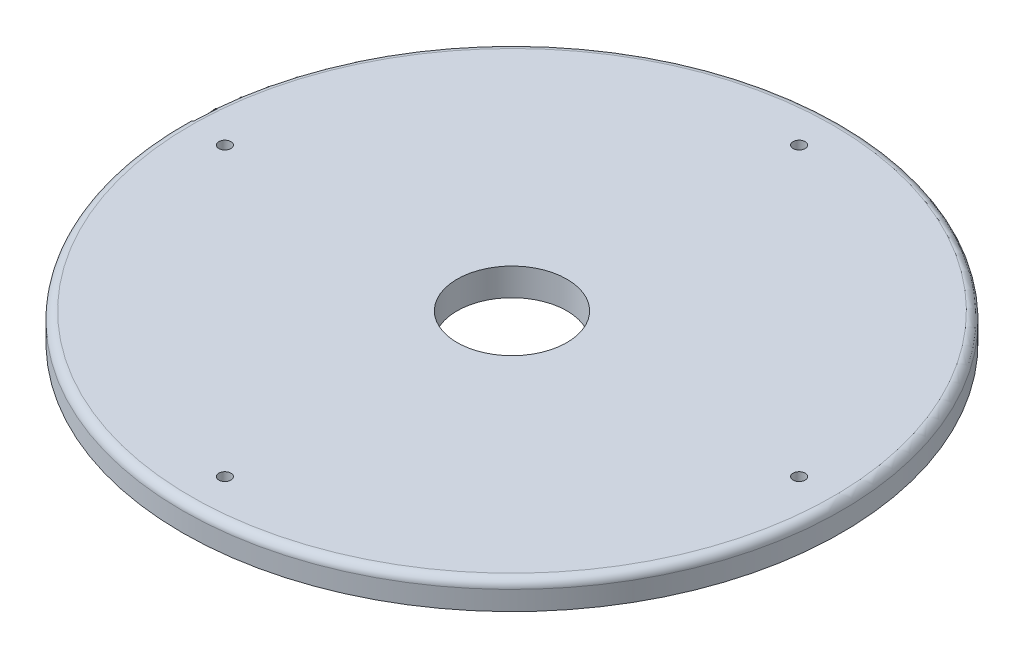
ISO-10303-21;
HEADER;
FILE_DESCRIPTION(('STEP AP214'),'2;1');
FILE_NAME('part.step','',(''),(''),'','','');
FILE_SCHEMA(('AUTOMOTIVE_DESIGN { 1 0 10303 214 1 1 1 1 }'));
ENDSEC;
DATA;
#1=APPLICATION_CONTEXT('core data for automotive mechanical design processes');
#2=APPLICATION_PROTOCOL_DEFINITION('international standard','automotive_design',2000,#1);
#3=PRODUCT_CONTEXT('',#1,'mechanical');
#4=PRODUCT('Part','Part','',(#3));
#5=PRODUCT_RELATED_PRODUCT_CATEGORY('part','',(#4));
#6=PRODUCT_DEFINITION_FORMATION('','',#4);
#7=PRODUCT_DEFINITION_CONTEXT('part definition',#1,'design');
#8=PRODUCT_DEFINITION('design','',#6,#7);
#9=PRODUCT_DEFINITION_SHAPE('','',#8);
#10=(LENGTH_UNIT() NAMED_UNIT(*) SI_UNIT(.MILLI.,.METRE.));
#11=(NAMED_UNIT(*) PLANE_ANGLE_UNIT() SI_UNIT($,.RADIAN.));
#12=(NAMED_UNIT(*) SI_UNIT($,.STERADIAN.) SOLID_ANGLE_UNIT());
#13=UNCERTAINTY_MEASURE_WITH_UNIT(LENGTH_MEASURE(1.E-05),#10,'distance_accuracy_value','');
#14=(GEOMETRIC_REPRESENTATION_CONTEXT(3) GLOBAL_UNCERTAINTY_ASSIGNED_CONTEXT((#13)) GLOBAL_UNIT_ASSIGNED_CONTEXT((#10,
#11,#12)) REPRESENTATION_CONTEXT('',''));
#15=CARTESIAN_POINT('',(0.,0.,0.));
#16=DIRECTION('',(0.,0.,1.));
#17=DIRECTION('',(1.,0.,0.));
#18=AXIS2_PLACEMENT_3D('',#15,#16,#17);
#19=CARTESIAN_POINT('',(0.,-73.,52.2744124434428));
#20=DIRECTION('',(0.,-1.,0.));
#21=DIRECTION('',(0.,0.,-1.));
#22=AXIS2_PLACEMENT_3D('',#19,#20,#21);
#23=CYLINDRICAL_SURFACE('',#22,1.1);
#24=CARTESIAN_POINT('',(0.,-75.,52.2744124434428));
#25=DIRECTION('',(0.,-1.,0.));
#26=DIRECTION('',(0.,0.,-1.));
#27=AXIS2_PLACEMENT_3D('',#24,#25,#26);
#28=CIRCLE('',#27,1.1);
#29=CARTESIAN_POINT('',(0.,-75.,51.1744124434428));
#30=VERTEX_POINT('',#29);
#31=EDGE_CURVE('E64',#30,#30,#28,.T.);
#32=ORIENTED_EDGE('',*,*,#31,.F.);
#33=EDGE_LOOP('',(#32));
#34=FACE_BOUND('',#33,.T.);
#35=CARTESIAN_POINT('',(0.,-77.5,52.2744124434428));
#36=DIRECTION('',(0.,-1.,0.));
#37=DIRECTION('',(0.,0.,-1.));
#38=AXIS2_PLACEMENT_3D('',#35,#36,#37);
#39=CIRCLE('',#38,1.1);
#40=CARTESIAN_POINT('',(0.,-77.5,51.1744124434428));
#41=VERTEX_POINT('',#40);
#42=EDGE_CURVE('E43',#41,#41,#39,.F.);
#43=ORIENTED_EDGE('',*,*,#42,.F.);
#44=EDGE_LOOP('',(#43));
#45=FACE_BOUND('',#44,.T.);
#46=ADVANCED_FACE('F39',(#34,#45),#23,.F.);
#47=CARTESIAN_POINT('',(52.2744124434428,-73.,0.));
#48=DIRECTION('',(0.,-1.,0.));
#49=DIRECTION('',(0.,0.,-1.));
#50=AXIS2_PLACEMENT_3D('',#47,#48,#49);
#51=CYLINDRICAL_SURFACE('',#50,1.1);
#52=CARTESIAN_POINT('',(52.2744124434428,-75.,0.));
#53=DIRECTION('',(0.,-1.,0.));
#54=DIRECTION('',(0.,0.,-1.));
#55=AXIS2_PLACEMENT_3D('',#52,#53,#54);
#56=CIRCLE('',#55,1.1);
#57=CARTESIAN_POINT('',(52.2744124434428,-75.,-1.09999999999999));
#58=VERTEX_POINT('',#57);
#59=EDGE_CURVE('E68',#58,#58,#56,.T.);
#60=ORIENTED_EDGE('',*,*,#59,.F.);
#61=EDGE_LOOP('',(#60));
#62=FACE_BOUND('',#61,.T.);
#63=CARTESIAN_POINT('',(52.2744124434428,-77.5,0.));
#64=DIRECTION('',(0.,-1.,0.));
#65=DIRECTION('',(0.,0.,-1.));
#66=AXIS2_PLACEMENT_3D('',#63,#64,#65);
#67=CIRCLE('',#66,1.1);
#68=CARTESIAN_POINT('',(52.2744124434428,-77.5,-1.09999999999999));
#69=VERTEX_POINT('',#68);
#70=EDGE_CURVE('E58',#69,#69,#67,.F.);
#71=ORIENTED_EDGE('',*,*,#70,.F.);
#72=EDGE_LOOP('',(#71));
#73=FACE_BOUND('',#72,.T.);
#74=ADVANCED_FACE('F109',(#62,#73),#51,.F.);
#75=CARTESIAN_POINT('',(0.,-73.,-52.2744124434428));
#76=DIRECTION('',(0.,-1.,0.));
#77=DIRECTION('',(0.,0.,-1.));
#78=AXIS2_PLACEMENT_3D('',#75,#76,#77);
#79=CYLINDRICAL_SURFACE('',#78,1.09999999999999);
#80=CARTESIAN_POINT('',(0.,-75.,-52.2744124434428));
#81=DIRECTION('',(0.,-1.,0.));
#82=DIRECTION('',(0.,0.,-1.));
#83=AXIS2_PLACEMENT_3D('',#80,#81,#82);
#84=CIRCLE('',#83,1.09999999999999);
#85=CARTESIAN_POINT('',(0.,-75.,-53.3744124434428));
#86=VERTEX_POINT('',#85);
#87=EDGE_CURVE('E73',#86,#86,#84,.T.);
#88=ORIENTED_EDGE('',*,*,#87,.F.);
#89=EDGE_LOOP('',(#88));
#90=FACE_BOUND('',#89,.T.);
#91=CARTESIAN_POINT('',(0.,-77.5,-52.2744124434428));
#92=DIRECTION('',(0.,-1.,0.));
#93=DIRECTION('',(0.,0.,-1.));
#94=AXIS2_PLACEMENT_3D('',#91,#92,#93);
#95=CIRCLE('',#94,1.09999999999999);
#96=CARTESIAN_POINT('',(0.,-77.5,-53.3744124434428));
#97=VERTEX_POINT('',#96);
#98=EDGE_CURVE('E56',#97,#97,#95,.F.);
#99=ORIENTED_EDGE('',*,*,#98,.F.);
#100=EDGE_LOOP('',(#99));
#101=FACE_BOUND('',#100,.T.);
#102=ADVANCED_FACE('F115',(#90,#101),#79,.F.);
#103=CARTESIAN_POINT('',(-52.2744124434428,-73.,0.));
#104=DIRECTION('',(0.,-1.,0.));
#105=DIRECTION('',(0.,0.,-1.));
#106=AXIS2_PLACEMENT_3D('',#103,#104,#105);
#107=CYLINDRICAL_SURFACE('',#106,1.1);
#108=CARTESIAN_POINT('',(-52.2744124434428,-75.,0.));
#109=DIRECTION('',(0.,-1.,0.));
#110=DIRECTION('',(0.,0.,-1.));
#111=AXIS2_PLACEMENT_3D('',#108,#109,#110);
#112=CIRCLE('',#111,1.1);
#113=CARTESIAN_POINT('',(-52.2744124434428,-75.,-1.1));
#114=VERTEX_POINT('',#113);
#115=EDGE_CURVE('E81',#114,#114,#112,.T.);
#116=ORIENTED_EDGE('',*,*,#115,.F.);
#117=EDGE_LOOP('',(#116));
#118=FACE_BOUND('',#117,.T.);
#119=CARTESIAN_POINT('',(-52.2744124434428,-77.5,0.));
#120=DIRECTION('',(0.,-1.,0.));
#121=DIRECTION('',(0.,0.,-1.));
#122=AXIS2_PLACEMENT_3D('',#119,#120,#121);
#123=CIRCLE('',#122,1.1);
#124=CARTESIAN_POINT('',(-52.2744124434428,-77.5,-1.1));
#125=VERTEX_POINT('',#124);
#126=EDGE_CURVE('E157',#125,#125,#123,.T.);
#127=ORIENTED_EDGE('',*,*,#126,.T.);
#128=EDGE_LOOP('',(#127));
#129=FACE_BOUND('',#128,.T.);
#130=ADVANCED_FACE('F106',(#118,#129),#107,.F.);
#131=CARTESIAN_POINT('',(0.,-75.,0.));
#132=DIRECTION('',(0.,-1.,0.));
#133=DIRECTION('',(0.,0.,-1.));
#134=AXIS2_PLACEMENT_3D('',#131,#132,#133);
#135=PLANE('',#134);
#136=ORIENTED_EDGE('',*,*,#115,.T.);
#137=EDGE_LOOP('',(#136));
#138=FACE_BOUND('',#137,.T.);
#139=ORIENTED_EDGE('',*,*,#87,.T.);
#140=EDGE_LOOP('',(#139));
#141=FACE_BOUND('',#140,.T.);
#142=ORIENTED_EDGE('',*,*,#59,.T.);
#143=EDGE_LOOP('',(#142));
#144=FACE_BOUND('',#143,.T.);
#145=ORIENTED_EDGE('',*,*,#31,.T.);
#146=EDGE_LOOP('',(#145));
#147=FACE_BOUND('',#146,.T.);
#148=CARTESIAN_POINT('',(0.,-75.,0.));
#149=DIRECTION('',(0.,-1.,0.));
#150=DIRECTION('',(0.,0.,-1.));
#151=AXIS2_PLACEMENT_3D('',#148,#149,#150);
#152=CIRCLE('',#151,58.4999954422835);
#153=CARTESIAN_POINT('',(0.,-75.,-58.4999954422835));
#154=VERTEX_POINT('',#153);
#155=EDGE_CURVE('E10',#154,#154,#152,.T.);
#156=ORIENTED_EDGE('',*,*,#155,.F.);
#157=EDGE_LOOP('',(#156));
#158=FACE_BOUND('',#157,.T.);
#159=CARTESIAN_POINT('',(0.,-75.,0.));
#160=DIRECTION('',(0.,-1.,0.));
#161=DIRECTION('',(0.,0.,-1.));
#162=AXIS2_PLACEMENT_3D('',#159,#160,#161);
#163=CIRCLE('',#162,10.);
#164=CARTESIAN_POINT('',(0.,-75.,-10.));
#165=VERTEX_POINT('',#164);
#166=EDGE_CURVE('E84',#165,#165,#163,.T.);
#167=ORIENTED_EDGE('',*,*,#166,.T.);
#168=EDGE_LOOP('',(#167));
#169=FACE_BOUND('',#168,.T.);
#170=ADVANCED_FACE('F41',(#138,#141,#144,#147,#158,#169),#135,.F.);
#171=CARTESIAN_POINT('',(0.,-76.5000045577165,0.));
#172=DIRECTION('',(0.,-1.,0.));
#173=DIRECTION('',(0.,0.,-1.));
#174=AXIS2_PLACEMENT_3D('',#171,#172,#173);
#175=TOROIDAL_SURFACE('',#174,58.4999954422835,1.50000455771654);
#176=CARTESIAN_POINT('',(0.,-76.5000045577165,0.));
#177=DIRECTION('',(0.,-1.,0.));
#178=DIRECTION('',(0.,0.,-1.));
#179=AXIS2_PLACEMENT_3D('',#176,#177,#178);
#180=CIRCLE('',#179,60.);
#181=CARTESIAN_POINT('',(0.,-76.5000045577165,-60.));
#182=VERTEX_POINT('',#181);
#183=EDGE_CURVE('E47',#182,#182,#180,.T.);
#184=ORIENTED_EDGE('',*,*,#183,.F.);
#185=EDGE_LOOP('',(#184));
#186=FACE_BOUND('',#185,.T.);
#187=ORIENTED_EDGE('',*,*,#155,.T.);
#188=EDGE_LOOP('',(#187));
#189=FACE_BOUND('',#188,.T.);
#190=ADVANCED_FACE('F98',(#186,#189),#175,.T.);
#191=CARTESIAN_POINT('',(0.,-9.99999999999999,0.));
#192=DIRECTION('',(0.,-1.,0.));
#193=DIRECTION('',(0.,0.,-1.));
#194=AXIS2_PLACEMENT_3D('',#191,#192,#193);
#195=CYLINDRICAL_SURFACE('',#194,60.);
#196=CARTESIAN_POINT('',(0.,-80.,0.));
#197=DIRECTION('',(0.,-1.,0.));
#198=DIRECTION('',(0.,0.,-1.));
#199=AXIS2_PLACEMENT_3D('',#196,#197,#198);
#200=CIRCLE('',#199,60.);
#201=CARTESIAN_POINT('',(0.,-80.,-60.));
#202=VERTEX_POINT('',#201);
#203=EDGE_CURVE('E52',#202,#202,#200,.T.);
#204=ORIENTED_EDGE('',*,*,#203,.F.);
#205=EDGE_LOOP('',(#204));
#206=FACE_BOUND('',#205,.T.);
#207=ORIENTED_EDGE('',*,*,#183,.T.);
#208=EDGE_LOOP('',(#207));
#209=FACE_BOUND('',#208,.T.);
#210=ADVANCED_FACE('F95',(#206,#209),#195,.T.);
#211=CARTESIAN_POINT('',(0.,-80.,0.));
#212=DIRECTION('',(0.,-1.,0.));
#213=DIRECTION('',(0.,0.,-1.));
#214=AXIS2_PLACEMENT_3D('',#211,#212,#213);
#215=PLANE('',#214);
#216=CARTESIAN_POINT('',(-52.2744124434428,-80.,0.));
#217=DIRECTION('',(0.,-1.,0.));
#218=DIRECTION('',(0.,0.,-1.));
#219=AXIS2_PLACEMENT_3D('',#216,#217,#218);
#220=CIRCLE('',#219,2.2);
#221=CARTESIAN_POINT('',(-52.2744124434428,-80.,-2.2));
#222=VERTEX_POINT('',#221);
#223=EDGE_CURVE('E133',#222,#222,#220,.T.);
#224=ORIENTED_EDGE('',*,*,#223,.F.);
#225=EDGE_LOOP('',(#224));
#226=FACE_BOUND('',#225,.T.);
#227=CARTESIAN_POINT('',(0.,-80.,-52.2744124434428));
#228=DIRECTION('',(0.,-1.,0.));
#229=DIRECTION('',(0.,0.,-1.));
#230=AXIS2_PLACEMENT_3D('',#227,#228,#229);
#231=CIRCLE('',#230,2.2);
#232=CARTESIAN_POINT('',(0.,-80.,-54.4744124434428));
#233=VERTEX_POINT('',#232);
#234=EDGE_CURVE('E137',#233,#233,#231,.T.);
#235=ORIENTED_EDGE('',*,*,#234,.F.);
#236=EDGE_LOOP('',(#235));
#237=FACE_BOUND('',#236,.T.);
#238=CARTESIAN_POINT('',(52.2744124434428,-80.,0.));
#239=DIRECTION('',(0.,-1.,0.));
#240=DIRECTION('',(0.,0.,-1.));
#241=AXIS2_PLACEMENT_3D('',#238,#239,#240);
#242=CIRCLE('',#241,2.2);
#243=CARTESIAN_POINT('',(52.2744124434428,-80.,-2.19999999999999));
#244=VERTEX_POINT('',#243);
#245=EDGE_CURVE('E141',#244,#244,#242,.T.);
#246=ORIENTED_EDGE('',*,*,#245,.F.);
#247=EDGE_LOOP('',(#246));
#248=FACE_BOUND('',#247,.T.);
#249=CARTESIAN_POINT('',(0.,-80.,52.2744124434428));
#250=DIRECTION('',(0.,-1.,0.));
#251=DIRECTION('',(0.,0.,-1.));
#252=AXIS2_PLACEMENT_3D('',#249,#250,#251);
#253=CIRCLE('',#252,2.2);
#254=CARTESIAN_POINT('',(0.,-80.,50.0744124434428));
#255=VERTEX_POINT('',#254);
#256=EDGE_CURVE('E144',#255,#255,#253,.T.);
#257=ORIENTED_EDGE('',*,*,#256,.F.);
#258=EDGE_LOOP('',(#257));
#259=FACE_BOUND('',#258,.T.);
#260=ORIENTED_EDGE('',*,*,#203,.T.);
#261=EDGE_LOOP('',(#260));
#262=FACE_BOUND('',#261,.T.);
#263=CARTESIAN_POINT('',(0.,-80.,0.));
#264=DIRECTION('',(0.,-1.,0.));
#265=DIRECTION('',(0.,0.,-1.));
#266=AXIS2_PLACEMENT_3D('',#263,#264,#265);
#267=CIRCLE('',#266,10.);
#268=CARTESIAN_POINT('',(0.,-80.,-10.));
#269=VERTEX_POINT('',#268);
#270=EDGE_CURVE('E87',#269,#269,#267,.T.);
#271=ORIENTED_EDGE('',*,*,#270,.F.);
#272=EDGE_LOOP('',(#271));
#273=FACE_BOUND('',#272,.T.);
#274=ADVANCED_FACE('F92',(#226,#237,#248,#259,#262,#273),#215,.T.);
#275=CARTESIAN_POINT('',(0.,-9.99999999999999,0.));
#276=DIRECTION('',(0.,-1.,0.));
#277=DIRECTION('',(0.,0.,-1.));
#278=AXIS2_PLACEMENT_3D('',#275,#276,#277);
#279=CYLINDRICAL_SURFACE('',#278,10.);
#280=ORIENTED_EDGE('',*,*,#270,.T.);
#281=EDGE_LOOP('',(#280));
#282=FACE_BOUND('',#281,.T.);
#283=ORIENTED_EDGE('',*,*,#166,.F.);
#284=EDGE_LOOP('',(#283));
#285=FACE_BOUND('',#284,.T.);
#286=ADVANCED_FACE('F121',(#282,#285),#279,.F.);
#287=CARTESIAN_POINT('',(-52.2744124434428,-77.5,0.));
#288=DIRECTION('',(0.,-1.,0.));
#289=DIRECTION('',(0.,0.,-1.));
#290=AXIS2_PLACEMENT_3D('',#287,#288,#289);
#291=CYLINDRICAL_SURFACE('',#290,2.2);
#292=CARTESIAN_POINT('',(-52.2744124434428,-77.5,0.));
#293=DIRECTION('',(0.,-1.,0.));
#294=DIRECTION('',(0.,0.,-1.));
#295=AXIS2_PLACEMENT_3D('',#292,#293,#294);
#296=CIRCLE('',#295,2.2);
#297=CARTESIAN_POINT('',(-52.2744124434428,-77.5,-2.2));
#298=VERTEX_POINT('',#297);
#299=EDGE_CURVE('E59',#298,#298,#296,.T.);
#300=ORIENTED_EDGE('',*,*,#299,.F.);
#301=EDGE_LOOP('',(#300));
#302=FACE_BOUND('',#301,.T.);
#303=ORIENTED_EDGE('',*,*,#223,.T.);
#304=EDGE_LOOP('',(#303));
#305=FACE_BOUND('',#304,.T.);
#306=ADVANCED_FACE('F124',(#302,#305),#291,.F.);
#307=CARTESIAN_POINT('',(0.,-77.5,0.));
#308=DIRECTION('',(0.,-1.,0.));
#309=DIRECTION('',(0.,0.,-1.));
#310=AXIS2_PLACEMENT_3D('',#307,#308,#309);
#311=PLANE('',#310);
#312=ORIENTED_EDGE('',*,*,#126,.F.);
#313=EDGE_LOOP('',(#312));
#314=FACE_BOUND('',#313,.T.);
#315=ORIENTED_EDGE('',*,*,#299,.T.);
#316=EDGE_LOOP('',(#315));
#317=FACE_BOUND('',#316,.T.);
#318=ADVANCED_FACE('F164',(#314,#317),#311,.T.);
#319=CARTESIAN_POINT('',(0.,-77.5,-52.2744124434428));
#320=DIRECTION('',(0.,-1.,0.));
#321=DIRECTION('',(0.,0.,-1.));
#322=AXIS2_PLACEMENT_3D('',#319,#320,#321);
#323=PLANE('',#322);
#324=CARTESIAN_POINT('',(0.,-77.5,-52.2744124434428));
#325=DIRECTION('',(0.,-1.,0.));
#326=DIRECTION('',(0.,0.,-1.));
#327=AXIS2_PLACEMENT_3D('',#324,#325,#326);
#328=CIRCLE('',#327,2.2);
#329=CARTESIAN_POINT('',(0.,-77.5,-54.4744124434428));
#330=VERTEX_POINT('',#329);
#331=EDGE_CURVE('E152',#330,#330,#328,.T.);
#332=ORIENTED_EDGE('',*,*,#331,.T.);
#333=EDGE_LOOP('',(#332));
#334=FACE_BOUND('',#333,.T.);
#335=ORIENTED_EDGE('',*,*,#98,.T.);
#336=EDGE_LOOP('',(#335));
#337=FACE_BOUND('',#336,.T.);
#338=ADVANCED_FACE('F167',(#334,#337),#323,.T.);
#339=CARTESIAN_POINT('',(0.,-77.5,-52.2744124434428));
#340=DIRECTION('',(0.,-1.,0.));
#341=DIRECTION('',(0.,0.,-1.));
#342=AXIS2_PLACEMENT_3D('',#339,#340,#341);
#343=CYLINDRICAL_SURFACE('',#342,2.2);
#344=ORIENTED_EDGE('',*,*,#331,.F.);
#345=EDGE_LOOP('',(#344));
#346=FACE_BOUND('',#345,.T.);
#347=ORIENTED_EDGE('',*,*,#234,.T.);
#348=EDGE_LOOP('',(#347));
#349=FACE_BOUND('',#348,.T.);
#350=ADVANCED_FACE('F177',(#346,#349),#343,.F.);
#351=CARTESIAN_POINT('',(52.2744124434428,-77.5,0.));
#352=DIRECTION('',(0.,-1.,0.));
#353=DIRECTION('',(0.,0.,-1.));
#354=AXIS2_PLACEMENT_3D('',#351,#352,#353);
#355=PLANE('',#354);
#356=CARTESIAN_POINT('',(52.2744124434428,-77.5,0.));
#357=DIRECTION('',(0.,-1.,0.));
#358=DIRECTION('',(0.,0.,-1.));
#359=AXIS2_PLACEMENT_3D('',#356,#357,#358);
#360=CIRCLE('',#359,2.2);
#361=CARTESIAN_POINT('',(52.2744124434428,-77.5,-2.19999999999999));
#362=VERTEX_POINT('',#361);
#363=EDGE_CURVE('E146',#362,#362,#360,.T.);
#364=ORIENTED_EDGE('',*,*,#363,.T.);
#365=EDGE_LOOP('',(#364));
#366=FACE_BOUND('',#365,.T.);
#367=ORIENTED_EDGE('',*,*,#70,.T.);
#368=EDGE_LOOP('',(#367));
#369=FACE_BOUND('',#368,.T.);
#370=ADVANCED_FACE('F180',(#366,#369),#355,.T.);
#371=CARTESIAN_POINT('',(52.2744124434428,-77.5,0.));
#372=DIRECTION('',(0.,-1.,0.));
#373=DIRECTION('',(0.,0.,-1.));
#374=AXIS2_PLACEMENT_3D('',#371,#372,#373);
#375=CYLINDRICAL_SURFACE('',#374,2.2);
#376=ORIENTED_EDGE('',*,*,#363,.F.);
#377=EDGE_LOOP('',(#376));
#378=FACE_BOUND('',#377,.T.);
#379=ORIENTED_EDGE('',*,*,#245,.T.);
#380=EDGE_LOOP('',(#379));
#381=FACE_BOUND('',#380,.T.);
#382=ADVANCED_FACE('F185',(#378,#381),#375,.F.);
#383=CARTESIAN_POINT('',(0.,-77.5,52.2744124434428));
#384=DIRECTION('',(0.,-1.,0.));
#385=DIRECTION('',(0.,0.,-1.));
#386=AXIS2_PLACEMENT_3D('',#383,#384,#385);
#387=PLANE('',#386);
#388=CARTESIAN_POINT('',(0.,-77.5,52.2744124434428));
#389=DIRECTION('',(0.,-1.,0.));
#390=DIRECTION('',(0.,0.,-1.));
#391=AXIS2_PLACEMENT_3D('',#388,#389,#390);
#392=CIRCLE('',#391,2.2);
#393=CARTESIAN_POINT('',(0.,-77.5,50.0744124434428));
#394=VERTEX_POINT('',#393);
#395=EDGE_CURVE('E76',#394,#394,#392,.T.);
#396=ORIENTED_EDGE('',*,*,#395,.T.);
#397=EDGE_LOOP('',(#396));
#398=FACE_BOUND('',#397,.T.);
#399=ORIENTED_EDGE('',*,*,#42,.T.);
#400=EDGE_LOOP('',(#399));
#401=FACE_BOUND('',#400,.T.);
#402=ADVANCED_FACE('F188',(#398,#401),#387,.T.);
#403=CARTESIAN_POINT('',(0.,-77.5,52.2744124434428));
#404=DIRECTION('',(0.,-1.,0.));
#405=DIRECTION('',(0.,0.,-1.));
#406=AXIS2_PLACEMENT_3D('',#403,#404,#405);
#407=CYLINDRICAL_SURFACE('',#406,2.2);
#408=ORIENTED_EDGE('',*,*,#395,.F.);
#409=EDGE_LOOP('',(#408));
#410=FACE_BOUND('',#409,.T.);
#411=ORIENTED_EDGE('',*,*,#256,.T.);
#412=EDGE_LOOP('',(#411));
#413=FACE_BOUND('',#412,.T.);
#414=ADVANCED_FACE('F193',(#410,#413),#407,.F.);
#415=CLOSED_SHELL('',(#46,#74,#102,#130,#170,#190,#210,#274,#286,#306,#318,#338,#350,#370,#382,
#402,#414));
#416=MANIFOLD_SOLID_BREP('B2',#415);
#417=ADVANCED_BREP_SHAPE_REPRESENTATION('',(#18,#416),#14);
#418=SHAPE_DEFINITION_REPRESENTATION(#9,#417);
ENDSEC;
END-ISO-10303-21;
